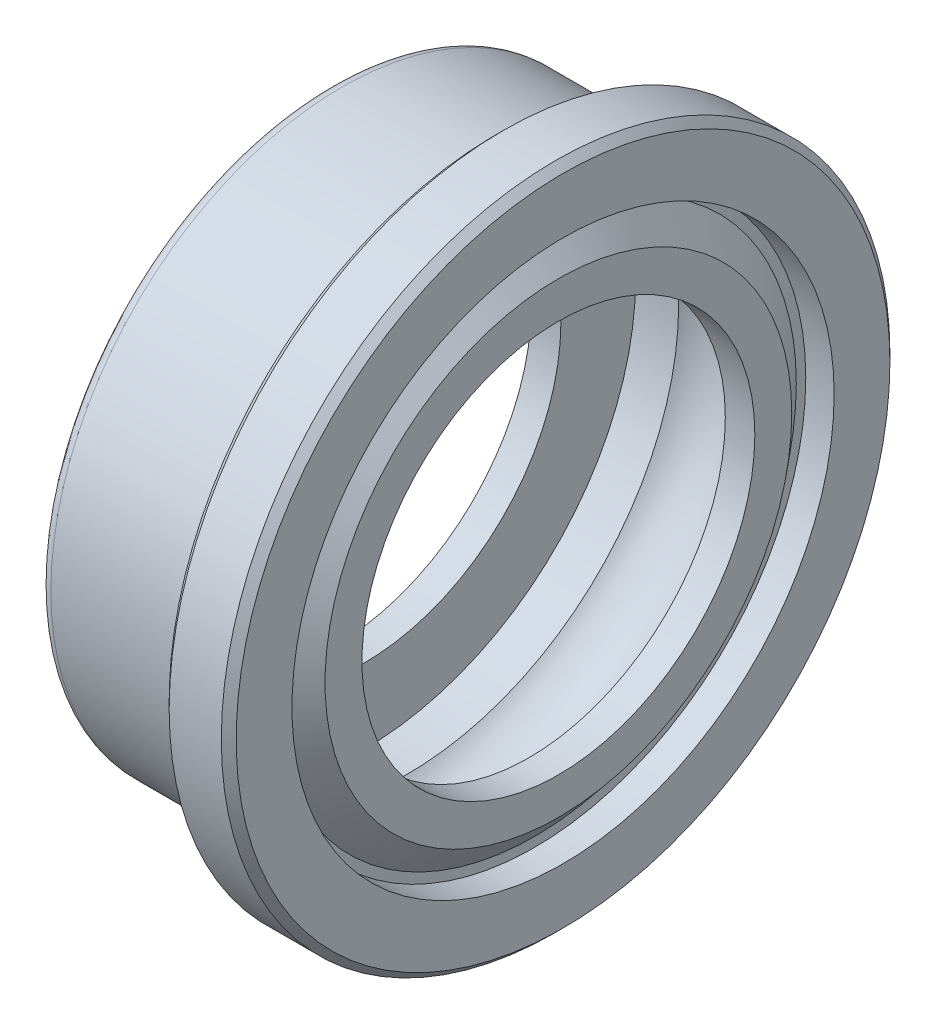
ISO-10303-21;
HEADER;
FILE_DESCRIPTION(('STEP AP214'),'2;1');
FILE_NAME('part.step','',(''),(''),'','','');
FILE_SCHEMA(('AUTOMOTIVE_DESIGN { 1 0 10303 214 1 1 1 1 }'));
ENDSEC;
DATA;
#1=APPLICATION_CONTEXT('core data for automotive mechanical design processes');
#2=APPLICATION_PROTOCOL_DEFINITION('international standard','automotive_design',2000,#1);
#3=PRODUCT_CONTEXT('',#1,'mechanical');
#4=PRODUCT('Part','Part','',(#3));
#5=PRODUCT_RELATED_PRODUCT_CATEGORY('part','',(#4));
#6=PRODUCT_DEFINITION_FORMATION('','',#4);
#7=PRODUCT_DEFINITION_CONTEXT('part definition',#1,'design');
#8=PRODUCT_DEFINITION('design','',#6,#7);
#9=PRODUCT_DEFINITION_SHAPE('','',#8);
#10=(LENGTH_UNIT() NAMED_UNIT(*) SI_UNIT(.MILLI.,.METRE.));
#11=(NAMED_UNIT(*) PLANE_ANGLE_UNIT() SI_UNIT($,.RADIAN.));
#12=(NAMED_UNIT(*) SI_UNIT($,.STERADIAN.) SOLID_ANGLE_UNIT());
#13=UNCERTAINTY_MEASURE_WITH_UNIT(LENGTH_MEASURE(1.E-05),#10,'distance_accuracy_value','');
#14=(GEOMETRIC_REPRESENTATION_CONTEXT(3) GLOBAL_UNCERTAINTY_ASSIGNED_CONTEXT((#13)) GLOBAL_UNIT_ASSIGNED_CONTEXT((#10,
#11,#12)) REPRESENTATION_CONTEXT('',''));
#15=CARTESIAN_POINT('',(0.,0.,0.));
#16=DIRECTION('',(0.,0.,1.));
#17=DIRECTION('',(1.,0.,0.));
#18=AXIS2_PLACEMENT_3D('',#15,#16,#17);
#19=CARTESIAN_POINT('',(0.,0.,0.));
#20=DIRECTION('',(1.,0.,0.));
#21=DIRECTION('',(0.,0.,-1.));
#22=AXIS2_PLACEMENT_3D('',#19,#20,#21);
#23=TOROIDAL_SURFACE('',#22,3.175,0.746125);
#24=CARTESIAN_POINT('',(0.532839828624654,0.,0.));
#25=DIRECTION('',(1.,0.,0.));
#26=DIRECTION('',(0.,0.,-1.));
#27=AXIS2_PLACEMENT_3D('',#24,#25,#26);
#28=CIRCLE('',#27,3.6972875);
#29=CARTESIAN_POINT('',(0.532839828624654,0.,-3.6972875));
#30=VERTEX_POINT('',#29);
#31=EDGE_CURVE('E106',#30,#30,#28,.T.);
#32=ORIENTED_EDGE('',*,*,#31,.T.);
#33=EDGE_LOOP('',(#32));
#34=FACE_BOUND('',#33,.T.);
#35=CARTESIAN_POINT('',(-0.532839828624654,0.,0.));
#36=DIRECTION('',(1.,0.,0.));
#37=DIRECTION('',(0.,0.,-1.));
#38=AXIS2_PLACEMENT_3D('',#35,#36,#37);
#39=CIRCLE('',#38,3.6972875);
#40=CARTESIAN_POINT('',(-0.532839828624654,0.,-3.6972875));
#41=VERTEX_POINT('',#40);
#42=EDGE_CURVE('E10',#41,#41,#39,.T.);
#43=ORIENTED_EDGE('',*,*,#42,.F.);
#44=EDGE_LOOP('',(#43));
#45=FACE_BOUND('',#44,.T.);
#46=ADVANCED_FACE('F30',(#34,#45),#23,.F.);
#47=CARTESIAN_POINT('',(-1.5875,0.,0.));
#48=DIRECTION('',(1.,0.,0.));
#49=DIRECTION('',(0.,0.,-1.));
#50=AXIS2_PLACEMENT_3D('',#47,#48,#49);
#51=CYLINDRICAL_SURFACE('',#50,3.6972875);
#52=ORIENTED_EDGE('',*,*,#42,.T.);
#53=EDGE_LOOP('',(#52));
#54=FACE_BOUND('',#53,.T.);
#55=CARTESIAN_POINT('',(-1.12129364556186,0.,0.));
#56=DIRECTION('',(1.,0.,0.));
#57=DIRECTION('',(0.,0.,-1.));
#58=AXIS2_PLACEMENT_3D('',#55,#56,#57);
#59=CIRCLE('',#58,3.6972875);
#60=CARTESIAN_POINT('',(-1.12129364556186,0.,-3.6972875));
#61=VERTEX_POINT('',#60);
#62=EDGE_CURVE('E36',#61,#61,#59,.T.);
#63=ORIENTED_EDGE('',*,*,#62,.F.);
#64=EDGE_LOOP('',(#63));
#65=FACE_BOUND('',#64,.T.);
#66=ADVANCED_FACE('F124',(#54,#65),#51,.F.);
#67=CARTESIAN_POINT('',(-1.12129364556186,2.679239625,0.));
#68=DIRECTION('',(1.,0.,0.));
#69=DIRECTION('',(0.,0.,-1.));
#70=AXIS2_PLACEMENT_3D('',#67,#68,#69);
#71=PLANE('',#70);
#72=ORIENTED_EDGE('',*,*,#62,.T.);
#73=EDGE_LOOP('',(#72));
#74=FACE_BOUND('',#73,.T.);
#75=CARTESIAN_POINT('',(-1.12129364556186,0.,0.));
#76=DIRECTION('',(1.,0.,0.));
#77=DIRECTION('',(0.,0.,-1.));
#78=AXIS2_PLACEMENT_3D('',#75,#76,#77);
#79=CIRCLE('',#78,2.679239625);
#80=CARTESIAN_POINT('',(-1.12129364556186,0.,-2.679239625));
#81=VERTEX_POINT('',#80);
#82=EDGE_CURVE('E40',#81,#81,#79,.T.);
#83=ORIENTED_EDGE('',*,*,#82,.F.);
#84=EDGE_LOOP('',(#83));
#85=FACE_BOUND('',#84,.T.);
#86=ADVANCED_FACE('F128',(#74,#85),#71,.T.);
#87=CARTESIAN_POINT('',(-1.5875,0.,0.));
#88=DIRECTION('',(1.,0.,0.));
#89=DIRECTION('',(0.,0.,-1.));
#90=AXIS2_PLACEMENT_3D('',#87,#88,#89);
#91=CYLINDRICAL_SURFACE('',#90,2.679239625);
#92=ORIENTED_EDGE('',*,*,#82,.T.);
#93=EDGE_LOOP('',(#92));
#94=FACE_BOUND('',#93,.T.);
#95=CARTESIAN_POINT('',(-1.524,0.,0.));
#96=DIRECTION('',(1.,0.,0.));
#97=DIRECTION('',(0.,0.,-1.));
#98=AXIS2_PLACEMENT_3D('',#95,#96,#97);
#99=CIRCLE('',#98,2.679239625);
#100=CARTESIAN_POINT('',(-1.524,0.,-2.679239625));
#101=VERTEX_POINT('',#100);
#102=EDGE_CURVE('E44',#101,#101,#99,.T.);
#103=ORIENTED_EDGE('',*,*,#102,.F.);
#104=EDGE_LOOP('',(#103));
#105=FACE_BOUND('',#104,.T.);
#106=ADVANCED_FACE('F132',(#94,#105),#91,.F.);
#107=CARTESIAN_POINT('',(-1.524,3.18255113425,0.));
#108=DIRECTION('',(-1.,0.,0.));
#109=DIRECTION('',(0.,0.,1.));
#110=AXIS2_PLACEMENT_3D('',#107,#108,#109);
#111=PLANE('',#110);
#112=ORIENTED_EDGE('',*,*,#102,.T.);
#113=EDGE_LOOP('',(#112));
#114=FACE_BOUND('',#113,.T.);
#115=CARTESIAN_POINT('',(-1.524,0.,0.));
#116=DIRECTION('',(1.,0.,0.));
#117=DIRECTION('',(0.,0.,-1.));
#118=AXIS2_PLACEMENT_3D('',#115,#116,#117);
#119=CIRCLE('',#118,3.18255113425);
#120=CARTESIAN_POINT('',(-1.524,0.,-3.18255113425));
#121=VERTEX_POINT('',#120);
#122=EDGE_CURVE('E49',#121,#121,#119,.T.);
#123=ORIENTED_EDGE('',*,*,#122,.F.);
#124=EDGE_LOOP('',(#123));
#125=FACE_BOUND('',#124,.T.);
#126=ADVANCED_FACE('F138',(#114,#125),#111,.T.);
#127=CARTESIAN_POINT('',(-1.20066864556187,0.,0.));
#128=DIRECTION('',(1.,0.,0.));
#129=DIRECTION('',(0.,0.,-1.));
#130=AXIS2_PLACEMENT_3D('',#127,#128,#129);
#131=CONICAL_SURFACE('',#130,3.5678824375,0.872664625997174);
#132=ORIENTED_EDGE('',*,*,#122,.T.);
#133=EDGE_LOOP('',(#132));
#134=FACE_BOUND('',#133,.T.);
#135=CARTESIAN_POINT('',(-1.20066864556187,0.,0.));
#136=DIRECTION('',(1.,0.,0.));
#137=DIRECTION('',(0.,0.,-1.));
#138=AXIS2_PLACEMENT_3D('',#135,#136,#137);
#139=CIRCLE('',#138,3.5678824375);
#140=CARTESIAN_POINT('',(-1.20066864556187,0.,-3.5678824375));
#141=VERTEX_POINT('',#140);
#142=EDGE_CURVE('E52',#141,#141,#139,.T.);
#143=ORIENTED_EDGE('',*,*,#142,.F.);
#144=EDGE_LOOP('',(#143));
#145=FACE_BOUND('',#144,.T.);
#146=ADVANCED_FACE('F142',(#134,#145),#131,.T.);
#147=CARTESIAN_POINT('',(-1.20066864556187,3.6972875,0.));
#148=DIRECTION('',(-1.,0.,0.));
#149=DIRECTION('',(0.,0.,1.));
#150=AXIS2_PLACEMENT_3D('',#147,#148,#149);
#151=PLANE('',#150);
#152=ORIENTED_EDGE('',*,*,#142,.T.);
#153=EDGE_LOOP('',(#152));
#154=FACE_BOUND('',#153,.T.);
#155=CARTESIAN_POINT('',(-1.20066864556186,0.,0.));
#156=DIRECTION('',(1.,0.,0.));
#157=DIRECTION('',(0.,0.,-1.));
#158=AXIS2_PLACEMENT_3D('',#155,#156,#157);
#159=CIRCLE('',#158,3.6972875);
#160=CARTESIAN_POINT('',(-1.20066864556186,0.,-3.6972875));
#161=VERTEX_POINT('',#160);
#162=EDGE_CURVE('E55',#161,#161,#159,.T.);
#163=ORIENTED_EDGE('',*,*,#162,.F.);
#164=EDGE_LOOP('',(#163));
#165=FACE_BOUND('',#164,.T.);
#166=ADVANCED_FACE('F146',(#154,#165),#151,.T.);
#167=CARTESIAN_POINT('',(-1.5875,0.,0.));
#168=DIRECTION('',(1.,0.,0.));
#169=DIRECTION('',(0.,0.,-1.));
#170=AXIS2_PLACEMENT_3D('',#167,#168,#169);
#171=CYLINDRICAL_SURFACE('',#170,3.6972875);
#172=ORIENTED_EDGE('',*,*,#162,.T.);
#173=EDGE_LOOP('',(#172));
#174=FACE_BOUND('',#173,.T.);
#175=CARTESIAN_POINT('',(-1.5875,0.,0.));
#176=DIRECTION('',(1.,0.,0.));
#177=DIRECTION('',(0.,0.,-1.));
#178=AXIS2_PLACEMENT_3D('',#175,#176,#177);
#179=CIRCLE('',#178,3.6972875);
#180=CARTESIAN_POINT('',(-1.5875,0.,-3.6972875));
#181=VERTEX_POINT('',#180);
#182=EDGE_CURVE('E58',#181,#181,#179,.T.);
#183=ORIENTED_EDGE('',*,*,#182,.F.);
#184=EDGE_LOOP('',(#183));
#185=FACE_BOUND('',#184,.T.);
#186=ADVANCED_FACE('F150',(#174,#185),#171,.F.);
#187=CARTESIAN_POINT('',(-1.5875,3.81,0.));
#188=DIRECTION('',(-1.,0.,0.));
#189=DIRECTION('',(0.,0.,1.));
#190=AXIS2_PLACEMENT_3D('',#187,#188,#189);
#191=PLANE('',#190);
#192=ORIENTED_EDGE('',*,*,#182,.T.);
#193=EDGE_LOOP('',(#192));
#194=FACE_BOUND('',#193,.T.);
#195=CARTESIAN_POINT('',(-1.5875,0.,0.));
#196=DIRECTION('',(1.,0.,0.));
#197=DIRECTION('',(0.,0.,-1.));
#198=AXIS2_PLACEMENT_3D('',#195,#196,#197);
#199=CIRCLE('',#198,3.81);
#200=CARTESIAN_POINT('',(-1.5875,0.,-3.81));
#201=VERTEX_POINT('',#200);
#202=EDGE_CURVE('E61',#201,#201,#199,.T.);
#203=ORIENTED_EDGE('',*,*,#202,.F.);
#204=EDGE_LOOP('',(#203));
#205=FACE_BOUND('',#204,.T.);
#206=ADVANCED_FACE('F154',(#194,#205),#191,.T.);
#207=CARTESIAN_POINT('',(-1.42875,0.,0.));
#208=DIRECTION('',(1.,0.,0.));
#209=DIRECTION('',(0.,0.,-1.));
#210=AXIS2_PLACEMENT_3D('',#207,#208,#209);
#211=TOROIDAL_SURFACE('',#210,3.81,0.15875);
#212=ORIENTED_EDGE('',*,*,#202,.T.);
#213=EDGE_LOOP('',(#212));
#214=FACE_BOUND('',#213,.T.);
#215=CARTESIAN_POINT('',(-1.42875,0.,0.));
#216=DIRECTION('',(1.,0.,0.));
#217=DIRECTION('',(0.,0.,-1.));
#218=AXIS2_PLACEMENT_3D('',#215,#216,#217);
#219=CIRCLE('',#218,3.96875);
#220=CARTESIAN_POINT('',(-1.42875,0.,-3.96875));
#221=VERTEX_POINT('',#220);
#222=EDGE_CURVE('E64',#221,#221,#219,.T.);
#223=ORIENTED_EDGE('',*,*,#222,.F.);
#224=EDGE_LOOP('',(#223));
#225=FACE_BOUND('',#224,.T.);
#226=ADVANCED_FACE('F158',(#214,#225),#211,.T.);
#227=CARTESIAN_POINT('',(-1.5875,0.,0.));
#228=DIRECTION('',(1.,0.,0.));
#229=DIRECTION('',(0.,0.,-1.));
#230=AXIS2_PLACEMENT_3D('',#227,#228,#229);
#231=CYLINDRICAL_SURFACE('',#230,3.96875);
#232=ORIENTED_EDGE('',*,*,#222,.T.);
#233=EDGE_LOOP('',(#232));
#234=FACE_BOUND('',#233,.T.);
#235=CARTESIAN_POINT('',(0.520699999999999,0.,0.));
#236=DIRECTION('',(1.,0.,0.));
#237=DIRECTION('',(0.,0.,-1.));
#238=AXIS2_PLACEMENT_3D('',#235,#236,#237);
#239=CIRCLE('',#238,3.96875);
#240=CARTESIAN_POINT('',(0.520699999999999,0.,-3.96875));
#241=VERTEX_POINT('',#240);
#242=EDGE_CURVE('E67',#241,#241,#239,.T.);
#243=ORIENTED_EDGE('',*,*,#242,.F.);
#244=EDGE_LOOP('',(#243));
#245=FACE_BOUND('',#244,.T.);
#246=ADVANCED_FACE('F162',(#234,#245),#231,.T.);
#247=CARTESIAN_POINT('',(0.5207,0.,0.));
#248=DIRECTION('',(1.,0.,0.));
#249=DIRECTION('',(0.,0.,-1.));
#250=AXIS2_PLACEMENT_3D('',#247,#248,#249);
#251=TOROIDAL_SURFACE('',#250,4.12115,0.1524);
#252=ORIENTED_EDGE('',*,*,#242,.T.);
#253=EDGE_LOOP('',(#252));
#254=FACE_BOUND('',#253,.T.);
#255=CARTESIAN_POINT('',(0.6731,0.,0.));
#256=DIRECTION('',(1.,0.,0.));
#257=DIRECTION('',(0.,0.,-1.));
#258=AXIS2_PLACEMENT_3D('',#255,#256,#257);
#259=CIRCLE('',#258,4.12115);
#260=CARTESIAN_POINT('',(0.6731,0.,-4.12115));
#261=VERTEX_POINT('',#260);
#262=EDGE_CURVE('E70',#261,#261,#259,.T.);
#263=ORIENTED_EDGE('',*,*,#262,.F.);
#264=EDGE_LOOP('',(#263));
#265=FACE_BOUND('',#264,.T.);
#266=ADVANCED_FACE('F166',(#254,#265),#251,.F.);
#267=CARTESIAN_POINT('',(0.6731,4.4577,0.));
#268=DIRECTION('',(-1.,0.,0.));
#269=DIRECTION('',(0.,0.,1.));
#270=AXIS2_PLACEMENT_3D('',#267,#268,#269);
#271=PLANE('',#270);
#272=ORIENTED_EDGE('',*,*,#262,.T.);
#273=EDGE_LOOP('',(#272));
#274=FACE_BOUND('',#273,.T.);
#275=CARTESIAN_POINT('',(0.673099999999999,0.,0.));
#276=DIRECTION('',(1.,0.,0.));
#277=DIRECTION('',(0.,0.,-1.));
#278=AXIS2_PLACEMENT_3D('',#275,#276,#277);
#279=CIRCLE('',#278,4.4577);
#280=CARTESIAN_POINT('',(0.673099999999999,0.,-4.4577));
#281=VERTEX_POINT('',#280);
#282=EDGE_CURVE('E73',#281,#281,#279,.T.);
#283=ORIENTED_EDGE('',*,*,#282,.F.);
#284=EDGE_LOOP('',(#283));
#285=FACE_BOUND('',#284,.T.);
#286=ADVANCED_FACE('F170',(#274,#285),#271,.T.);
#287=CARTESIAN_POINT('',(0.774700000000002,0.,0.));
#288=DIRECTION('',(1.,0.,0.));
#289=DIRECTION('',(0.,0.,-1.));
#290=AXIS2_PLACEMENT_3D('',#287,#288,#289);
#291=CONICAL_SURFACE('',#290,4.5593,0.785398163397431);
#292=ORIENTED_EDGE('',*,*,#282,.T.);
#293=EDGE_LOOP('',(#292));
#294=FACE_BOUND('',#293,.T.);
#295=CARTESIAN_POINT('',(0.774700000000002,0.,0.));
#296=DIRECTION('',(1.,0.,0.));
#297=DIRECTION('',(0.,0.,-1.));
#298=AXIS2_PLACEMENT_3D('',#295,#296,#297);
#299=CIRCLE('',#298,4.5593);
#300=CARTESIAN_POINT('',(0.774700000000002,0.,-4.5593));
#301=VERTEX_POINT('',#300);
#302=EDGE_CURVE('E76',#301,#301,#299,.T.);
#303=ORIENTED_EDGE('',*,*,#302,.F.);
#304=EDGE_LOOP('',(#303));
#305=FACE_BOUND('',#304,.T.);
#306=ADVANCED_FACE('F174',(#294,#305),#291,.T.);
#307=CARTESIAN_POINT('',(-1.5875,0.,0.));
#308=DIRECTION('',(1.,0.,0.));
#309=DIRECTION('',(0.,0.,-1.));
#310=AXIS2_PLACEMENT_3D('',#307,#308,#309);
#311=CYLINDRICAL_SURFACE('',#310,4.5593);
#312=ORIENTED_EDGE('',*,*,#302,.T.);
#313=EDGE_LOOP('',(#312));
#314=FACE_BOUND('',#313,.T.);
#315=CARTESIAN_POINT('',(1.4859,0.,0.));
#316=DIRECTION('',(1.,0.,0.));
#317=DIRECTION('',(0.,0.,-1.));
#318=AXIS2_PLACEMENT_3D('',#315,#316,#317);
#319=CIRCLE('',#318,4.5593);
#320=CARTESIAN_POINT('',(1.4859,0.,-4.5593));
#321=VERTEX_POINT('',#320);
#322=EDGE_CURVE('E79',#321,#321,#319,.T.);
#323=ORIENTED_EDGE('',*,*,#322,.F.);
#324=EDGE_LOOP('',(#323));
#325=FACE_BOUND('',#324,.T.);
#326=ADVANCED_FACE('F178',(#314,#325),#311,.T.);
#327=CARTESIAN_POINT('',(1.5875,0.,0.));
#328=DIRECTION('',(-1.,0.,0.));
#329=DIRECTION('',(0.,0.,1.));
#330=AXIS2_PLACEMENT_3D('',#327,#328,#329);
#331=CONICAL_SURFACE('',#330,4.4577,0.785398163397442);
#332=ORIENTED_EDGE('',*,*,#322,.T.);
#333=EDGE_LOOP('',(#332));
#334=FACE_BOUND('',#333,.T.);
#335=CARTESIAN_POINT('',(1.5875,0.,0.));
#336=DIRECTION('',(1.,0.,0.));
#337=DIRECTION('',(0.,0.,-1.));
#338=AXIS2_PLACEMENT_3D('',#335,#336,#337);
#339=CIRCLE('',#338,4.4577);
#340=CARTESIAN_POINT('',(1.5875,0.,-4.4577));
#341=VERTEX_POINT('',#340);
#342=EDGE_CURVE('E82',#341,#341,#339,.T.);
#343=ORIENTED_EDGE('',*,*,#342,.F.);
#344=EDGE_LOOP('',(#343));
#345=FACE_BOUND('',#344,.T.);
#346=ADVANCED_FACE('F182',(#334,#345),#331,.T.);
#347=CARTESIAN_POINT('',(1.5875,3.6972875,0.));
#348=DIRECTION('',(1.,0.,0.));
#349=DIRECTION('',(0.,0.,-1.));
#350=AXIS2_PLACEMENT_3D('',#347,#348,#349);
#351=PLANE('',#350);
#352=ORIENTED_EDGE('',*,*,#342,.T.);
#353=EDGE_LOOP('',(#352));
#354=FACE_BOUND('',#353,.T.);
#355=CARTESIAN_POINT('',(1.5875,0.,0.));
#356=DIRECTION('',(1.,0.,0.));
#357=DIRECTION('',(0.,0.,-1.));
#358=AXIS2_PLACEMENT_3D('',#355,#356,#357);
#359=CIRCLE('',#358,3.6972875);
#360=CARTESIAN_POINT('',(1.5875,0.,-3.6972875));
#361=VERTEX_POINT('',#360);
#362=EDGE_CURVE('E85',#361,#361,#359,.T.);
#363=ORIENTED_EDGE('',*,*,#362,.F.);
#364=EDGE_LOOP('',(#363));
#365=FACE_BOUND('',#364,.T.);
#366=ADVANCED_FACE('F186',(#354,#365),#351,.T.);
#367=CARTESIAN_POINT('',(-1.5875,0.,0.));
#368=DIRECTION('',(1.,0.,0.));
#369=DIRECTION('',(0.,0.,-1.));
#370=AXIS2_PLACEMENT_3D('',#367,#368,#369);
#371=CYLINDRICAL_SURFACE('',#370,3.6972875);
#372=ORIENTED_EDGE('',*,*,#362,.T.);
#373=EDGE_LOOP('',(#372));
#374=FACE_BOUND('',#373,.T.);
#375=CARTESIAN_POINT('',(1.20066864556186,0.,0.));
#376=DIRECTION('',(1.,0.,0.));
#377=DIRECTION('',(0.,0.,-1.));
#378=AXIS2_PLACEMENT_3D('',#375,#376,#377);
#379=CIRCLE('',#378,3.6972875);
#380=CARTESIAN_POINT('',(1.20066864556186,0.,-3.6972875));
#381=VERTEX_POINT('',#380);
#382=EDGE_CURVE('E88',#381,#381,#379,.T.);
#383=ORIENTED_EDGE('',*,*,#382,.F.);
#384=EDGE_LOOP('',(#383));
#385=FACE_BOUND('',#384,.T.);
#386=ADVANCED_FACE('F190',(#374,#385),#371,.F.);
#387=CARTESIAN_POINT('',(1.20066864556187,3.56788243749999,0.));
#388=DIRECTION('',(1.,0.,0.));
#389=DIRECTION('',(0.,0.,-1.));
#390=AXIS2_PLACEMENT_3D('',#387,#388,#389);
#391=PLANE('',#390);
#392=ORIENTED_EDGE('',*,*,#382,.T.);
#393=EDGE_LOOP('',(#392));
#394=FACE_BOUND('',#393,.T.);
#395=CARTESIAN_POINT('',(1.20066864556187,0.,0.));
#396=DIRECTION('',(1.,0.,0.));
#397=DIRECTION('',(0.,0.,-1.));
#398=AXIS2_PLACEMENT_3D('',#395,#396,#397);
#399=CIRCLE('',#398,3.56788243749999);
#400=CARTESIAN_POINT('',(1.20066864556187,0.,-3.56788243749999));
#401=VERTEX_POINT('',#400);
#402=EDGE_CURVE('E91',#401,#401,#399,.T.);
#403=ORIENTED_EDGE('',*,*,#402,.F.);
#404=EDGE_LOOP('',(#403));
#405=FACE_BOUND('',#404,.T.);
#406=ADVANCED_FACE('F194',(#394,#405),#391,.T.);
#407=CARTESIAN_POINT('',(1.524,0.,0.));
#408=DIRECTION('',(-1.,0.,0.));
#409=DIRECTION('',(0.,0.,1.));
#410=AXIS2_PLACEMENT_3D('',#407,#408,#409);
#411=CONICAL_SURFACE('',#410,3.18255113425,0.872664625997161);
#412=ORIENTED_EDGE('',*,*,#402,.T.);
#413=EDGE_LOOP('',(#412));
#414=FACE_BOUND('',#413,.T.);
#415=CARTESIAN_POINT('',(1.524,0.,0.));
#416=DIRECTION('',(1.,0.,0.));
#417=DIRECTION('',(0.,0.,-1.));
#418=AXIS2_PLACEMENT_3D('',#415,#416,#417);
#419=CIRCLE('',#418,3.18255113425);
#420=CARTESIAN_POINT('',(1.524,0.,-3.18255113425));
#421=VERTEX_POINT('',#420);
#422=EDGE_CURVE('E94',#421,#421,#419,.T.);
#423=ORIENTED_EDGE('',*,*,#422,.F.);
#424=EDGE_LOOP('',(#423));
#425=FACE_BOUND('',#424,.T.);
#426=ADVANCED_FACE('F198',(#414,#425),#411,.T.);
#427=CARTESIAN_POINT('',(1.524,2.679239625,0.));
#428=DIRECTION('',(1.,0.,0.));
#429=DIRECTION('',(0.,0.,-1.));
#430=AXIS2_PLACEMENT_3D('',#427,#428,#429);
#431=PLANE('',#430);
#432=ORIENTED_EDGE('',*,*,#422,.T.);
#433=EDGE_LOOP('',(#432));
#434=FACE_BOUND('',#433,.T.);
#435=CARTESIAN_POINT('',(1.524,0.,0.));
#436=DIRECTION('',(1.,0.,0.));
#437=DIRECTION('',(0.,0.,-1.));
#438=AXIS2_PLACEMENT_3D('',#435,#436,#437);
#439=CIRCLE('',#438,2.679239625);
#440=CARTESIAN_POINT('',(1.524,0.,-2.679239625));
#441=VERTEX_POINT('',#440);
#442=EDGE_CURVE('E97',#441,#441,#439,.T.);
#443=ORIENTED_EDGE('',*,*,#442,.F.);
#444=EDGE_LOOP('',(#443));
#445=FACE_BOUND('',#444,.T.);
#446=ADVANCED_FACE('F202',(#434,#445),#431,.T.);
#447=CARTESIAN_POINT('',(-1.5875,0.,0.));
#448=DIRECTION('',(1.,0.,0.));
#449=DIRECTION('',(0.,0.,-1.));
#450=AXIS2_PLACEMENT_3D('',#447,#448,#449);
#451=CYLINDRICAL_SURFACE('',#450,2.679239625);
#452=ORIENTED_EDGE('',*,*,#442,.T.);
#453=EDGE_LOOP('',(#452));
#454=FACE_BOUND('',#453,.T.);
#455=CARTESIAN_POINT('',(1.12129364556186,0.,0.));
#456=DIRECTION('',(1.,0.,0.));
#457=DIRECTION('',(0.,0.,-1.));
#458=AXIS2_PLACEMENT_3D('',#455,#456,#457);
#459=CIRCLE('',#458,2.679239625);
#460=CARTESIAN_POINT('',(1.12129364556186,0.,-2.679239625));
#461=VERTEX_POINT('',#460);
#462=EDGE_CURVE('E100',#461,#461,#459,.T.);
#463=ORIENTED_EDGE('',*,*,#462,.F.);
#464=EDGE_LOOP('',(#463));
#465=FACE_BOUND('',#464,.T.);
#466=ADVANCED_FACE('F120',(#454,#465),#451,.F.);
#467=CARTESIAN_POINT('',(1.12129364556186,3.6972875,0.));
#468=DIRECTION('',(-1.,0.,0.));
#469=DIRECTION('',(0.,0.,1.));
#470=AXIS2_PLACEMENT_3D('',#467,#468,#469);
#471=PLANE('',#470);
#472=ORIENTED_EDGE('',*,*,#462,.T.);
#473=EDGE_LOOP('',(#472));
#474=FACE_BOUND('',#473,.T.);
#475=CARTESIAN_POINT('',(1.12129364556186,0.,0.));
#476=DIRECTION('',(1.,0.,0.));
#477=DIRECTION('',(0.,0.,-1.));
#478=AXIS2_PLACEMENT_3D('',#475,#476,#477);
#479=CIRCLE('',#478,3.6972875);
#480=CARTESIAN_POINT('',(1.12129364556186,0.,-3.6972875));
#481=VERTEX_POINT('',#480);
#482=EDGE_CURVE('E103',#481,#481,#479,.T.);
#483=ORIENTED_EDGE('',*,*,#482,.F.);
#484=EDGE_LOOP('',(#483));
#485=FACE_BOUND('',#484,.T.);
#486=ADVANCED_FACE('F114',(#474,#485),#471,.T.);
#487=CARTESIAN_POINT('',(-1.5875,0.,0.));
#488=DIRECTION('',(1.,0.,0.));
#489=DIRECTION('',(0.,0.,-1.));
#490=AXIS2_PLACEMENT_3D('',#487,#488,#489);
#491=CYLINDRICAL_SURFACE('',#490,3.6972875);
#492=ORIENTED_EDGE('',*,*,#482,.T.);
#493=EDGE_LOOP('',(#492));
#494=FACE_BOUND('',#493,.T.);
#495=ORIENTED_EDGE('',*,*,#31,.F.);
#496=EDGE_LOOP('',(#495));
#497=FACE_BOUND('',#496,.T.);
#498=ADVANCED_FACE('F112',(#494,#497),#491,.F.);
#499=CLOSED_SHELL('',(#46,#66,#86,#106,#126,#146,#166,#186,#206,#226,#246,#266,#286,#306,#326,
#346,#366,#386,#406,#426,#446,#466,#486,#498));
#500=MANIFOLD_SOLID_BREP('B2',#499);
#501=ADVANCED_BREP_SHAPE_REPRESENTATION('',(#18,#500),#14);
#502=SHAPE_DEFINITION_REPRESENTATION(#9,#501);
ENDSEC;
END-ISO-10303-21;
